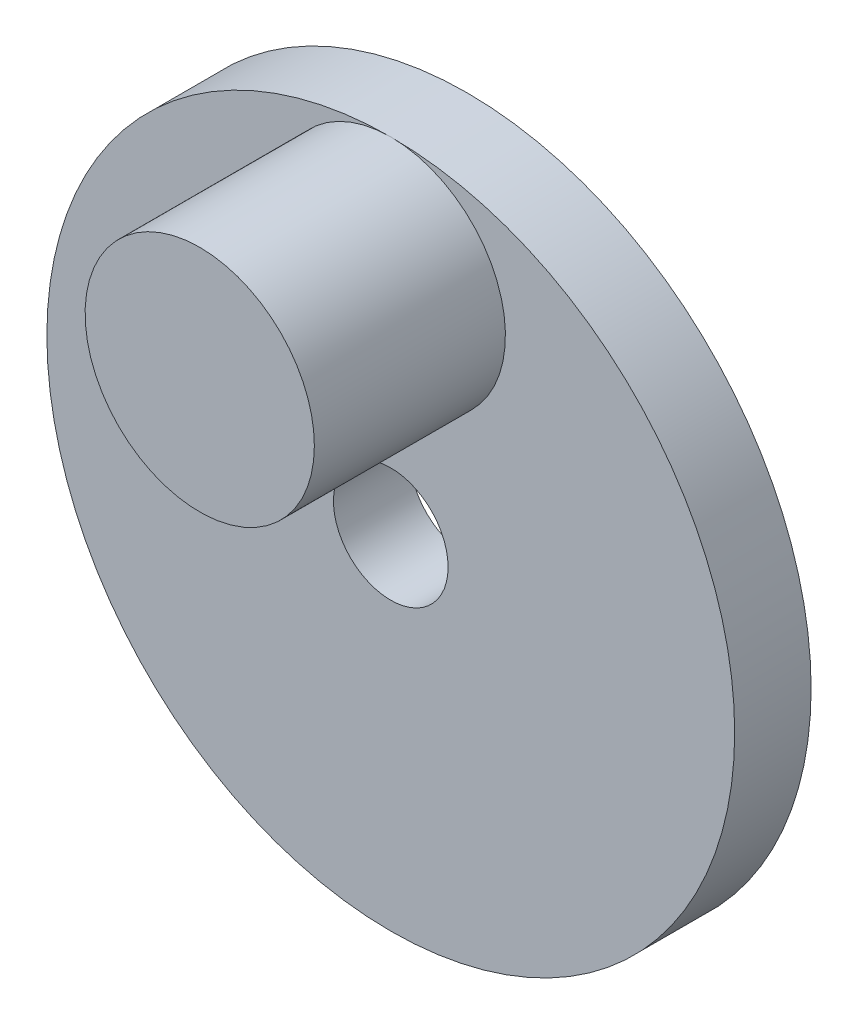
ISO-10303-21;
HEADER;
FILE_DESCRIPTION(('STEP AP214'),'2;1');
FILE_NAME('part.step','',(''),(''),'','','');
FILE_SCHEMA(('AUTOMOTIVE_DESIGN { 1 0 10303 214 1 1 1 1 }'));
ENDSEC;
DATA;
#1=APPLICATION_CONTEXT('core data for automotive mechanical design processes');
#2=APPLICATION_PROTOCOL_DEFINITION('international standard','automotive_design',2000,#1);
#3=PRODUCT_CONTEXT('',#1,'mechanical');
#4=PRODUCT('Part','Part','',(#3));
#5=PRODUCT_RELATED_PRODUCT_CATEGORY('part','',(#4));
#6=PRODUCT_DEFINITION_FORMATION('','',#4);
#7=PRODUCT_DEFINITION_CONTEXT('part definition',#1,'design');
#8=PRODUCT_DEFINITION('design','',#6,#7);
#9=PRODUCT_DEFINITION_SHAPE('','',#8);
#10=(LENGTH_UNIT() NAMED_UNIT(*) SI_UNIT(.MILLI.,.METRE.));
#11=(NAMED_UNIT(*) PLANE_ANGLE_UNIT() SI_UNIT($,.RADIAN.));
#12=(NAMED_UNIT(*) SI_UNIT($,.STERADIAN.) SOLID_ANGLE_UNIT());
#13=UNCERTAINTY_MEASURE_WITH_UNIT(LENGTH_MEASURE(1.E-05),#10,'distance_accuracy_value','');
#14=(GEOMETRIC_REPRESENTATION_CONTEXT(3) GLOBAL_UNCERTAINTY_ASSIGNED_CONTEXT((#13)) GLOBAL_UNIT_ASSIGNED_CONTEXT((#10,
#11,#12)) REPRESENTATION_CONTEXT('',''));
#15=CARTESIAN_POINT('',(0.,0.,0.));
#16=DIRECTION('',(0.,0.,1.));
#17=DIRECTION('',(1.,0.,0.));
#18=AXIS2_PLACEMENT_3D('',#15,#16,#17);
#19=CARTESIAN_POINT('',(0.,0.,2.));
#20=DIRECTION('',(0.,0.,1.));
#21=DIRECTION('',(1.,0.,0.));
#22=AXIS2_PLACEMENT_3D('',#19,#20,#21);
#23=PLANE('',#22);
#24=CARTESIAN_POINT('',(0.,0.,2.));
#25=DIRECTION('',(0.,0.,1.));
#26=DIRECTION('',(1.,0.,0.));
#27=AXIS2_PLACEMENT_3D('',#24,#25,#26);
#28=CIRCLE('',#27,9.);
#29=CARTESIAN_POINT('',(0.,9.,2.));
#30=VERTEX_POINT('',#29);
#31=EDGE_CURVE('E11',#30,#30,#28,.T.);
#32=ORIENTED_EDGE('',*,*,#31,.T.);
#33=CARTESIAN_POINT('',(0.,6.,2.));
#34=DIRECTION('',(0.,0.,1.));
#35=DIRECTION('',(1.,0.,0.));
#36=AXIS2_PLACEMENT_3D('',#33,#34,#35);
#37=CIRCLE('',#36,3.);
#38=EDGE_CURVE('E51',#30,#30,#37,.T.);
#39=ORIENTED_EDGE('',*,*,#38,.F.);
#40=EDGE_LOOP('',(#32,#39));
#41=FACE_BOUND('',#40,.T.);
#42=CARTESIAN_POINT('',(0.,0.,2.));
#43=DIRECTION('',(0.,0.,1.));
#44=DIRECTION('',(1.,0.,0.));
#45=AXIS2_PLACEMENT_3D('',#42,#43,#44);
#46=CIRCLE('',#45,1.5);
#47=CARTESIAN_POINT('',(1.5,0.,2.));
#48=VERTEX_POINT('',#47);
#49=EDGE_CURVE('E59',#48,#48,#46,.T.);
#50=ORIENTED_EDGE('',*,*,#49,.F.);
#51=EDGE_LOOP('',(#50));
#52=FACE_BOUND('',#51,.T.);
#53=ADVANCED_FACE('F36',(#41,#52),#23,.T.);
#54=CARTESIAN_POINT('',(0.,0.,0.));
#55=DIRECTION('',(0.,0.,1.));
#56=DIRECTION('',(1.,0.,0.));
#57=AXIS2_PLACEMENT_3D('',#54,#55,#56);
#58=PLANE('',#57);
#59=CARTESIAN_POINT('',(0.,0.,0.));
#60=DIRECTION('',(0.,0.,1.));
#61=DIRECTION('',(1.,0.,0.));
#62=AXIS2_PLACEMENT_3D('',#59,#60,#61);
#63=CIRCLE('',#62,9.);
#64=CARTESIAN_POINT('',(9.,0.,0.));
#65=VERTEX_POINT('',#64);
#66=EDGE_CURVE('E40',#65,#65,#63,.T.);
#67=ORIENTED_EDGE('',*,*,#66,.F.);
#68=EDGE_LOOP('',(#67));
#69=FACE_BOUND('',#68,.T.);
#70=CARTESIAN_POINT('',(0.,0.,0.));
#71=DIRECTION('',(0.,0.,1.));
#72=DIRECTION('',(1.,0.,0.));
#73=AXIS2_PLACEMENT_3D('',#70,#71,#72);
#74=CIRCLE('',#73,1.5);
#75=CARTESIAN_POINT('',(1.5,0.,0.));
#76=VERTEX_POINT('',#75);
#77=EDGE_CURVE('E56',#76,#76,#74,.T.);
#78=ORIENTED_EDGE('',*,*,#77,.T.);
#79=EDGE_LOOP('',(#78));
#80=FACE_BOUND('',#79,.T.);
#81=ADVANCED_FACE('F65',(#69,#80),#58,.F.);
#82=CARTESIAN_POINT('',(0.,0.,2.));
#83=DIRECTION('',(0.,0.,-1.));
#84=DIRECTION('',(-1.,0.,0.));
#85=AXIS2_PLACEMENT_3D('',#82,#83,#84);
#86=CYLINDRICAL_SURFACE('',#85,9.);
#87=ORIENTED_EDGE('',*,*,#31,.F.);
#88=EDGE_LOOP('',(#87));
#89=FACE_BOUND('',#88,.T.);
#90=ORIENTED_EDGE('',*,*,#66,.T.);
#91=EDGE_LOOP('',(#90));
#92=FACE_BOUND('',#91,.T.);
#93=ADVANCED_FACE('F38',(#89,#92),#86,.T.);
#94=CARTESIAN_POINT('',(0.,0.,2.));
#95=DIRECTION('',(0.,0.,-1.));
#96=DIRECTION('',(-1.,0.,0.));
#97=AXIS2_PLACEMENT_3D('',#94,#95,#96);
#98=CYLINDRICAL_SURFACE('',#97,1.5);
#99=ORIENTED_EDGE('',*,*,#49,.T.);
#100=EDGE_LOOP('',(#99));
#101=FACE_BOUND('',#100,.T.);
#102=ORIENTED_EDGE('',*,*,#77,.F.);
#103=EDGE_LOOP('',(#102));
#104=FACE_BOUND('',#103,.T.);
#105=ADVANCED_FACE('F67',(#101,#104),#98,.F.);
#106=CARTESIAN_POINT('',(0.,6.,7.));
#107=DIRECTION('',(0.,0.,-1.));
#108=DIRECTION('',(-1.,0.,0.));
#109=AXIS2_PLACEMENT_3D('',#106,#107,#108);
#110=CYLINDRICAL_SURFACE('',#109,3.);
#111=CARTESIAN_POINT('',(0.,6.,7.));
#112=DIRECTION('',(0.,0.,1.));
#113=DIRECTION('',(1.,0.,0.));
#114=AXIS2_PLACEMENT_3D('',#111,#112,#113);
#115=CIRCLE('',#114,3.);
#116=CARTESIAN_POINT('',(3.,6.,7.));
#117=VERTEX_POINT('',#116);
#118=EDGE_CURVE('E53',#117,#117,#115,.T.);
#119=ORIENTED_EDGE('',*,*,#118,.F.);
#120=EDGE_LOOP('',(#119));
#121=FACE_BOUND('',#120,.T.);
#122=ORIENTED_EDGE('',*,*,#38,.T.);
#123=EDGE_LOOP('',(#122));
#124=FACE_BOUND('',#123,.T.);
#125=ADVANCED_FACE('F69',(#121,#124),#110,.T.);
#126=CARTESIAN_POINT('',(0.,6.,7.));
#127=DIRECTION('',(0.,0.,1.));
#128=DIRECTION('',(1.,0.,0.));
#129=AXIS2_PLACEMENT_3D('',#126,#127,#128);
#130=PLANE('',#129);
#131=ORIENTED_EDGE('',*,*,#118,.T.);
#132=EDGE_LOOP('',(#131));
#133=FACE_BOUND('',#132,.T.);
#134=ADVANCED_FACE('F76',(#133),#130,.T.);
#135=CLOSED_SHELL('',(#53,#81,#93,#105,#125,#134));
#136=MANIFOLD_SOLID_BREP('B2',#135);
#137=ADVANCED_BREP_SHAPE_REPRESENTATION('',(#18,#136),#14);
#138=SHAPE_DEFINITION_REPRESENTATION(#9,#137);
ENDSEC;
END-ISO-10303-21;
